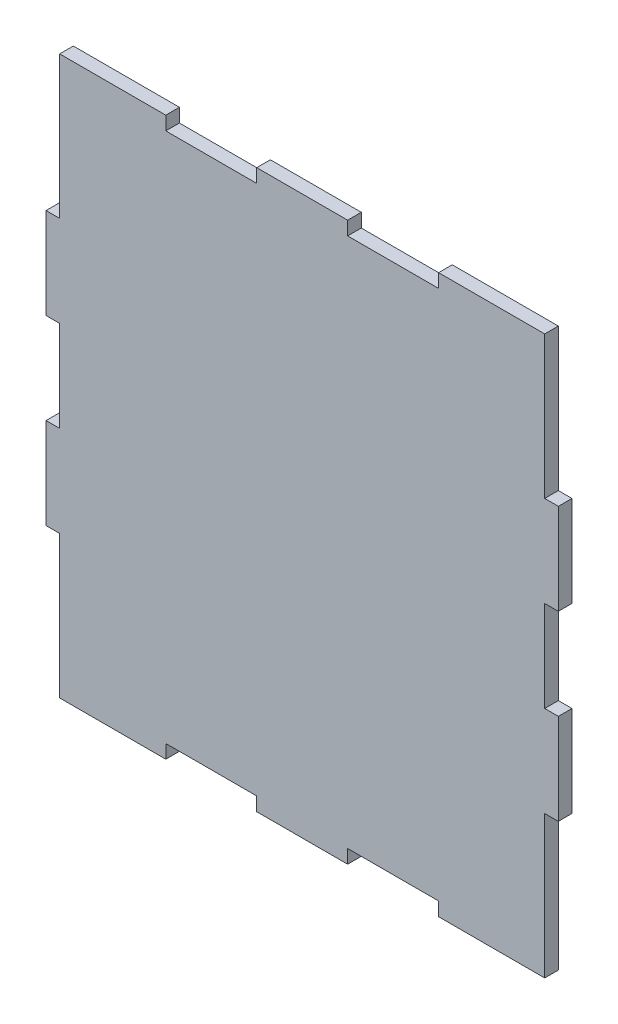
ISO-10303-21;
HEADER;
FILE_DESCRIPTION(('STEP AP214'),'2;1');
FILE_NAME('part.step','',(''),(''),'','','');
FILE_SCHEMA(('AUTOMOTIVE_DESIGN { 1 0 10303 214 1 1 1 1 }'));
ENDSEC;
DATA;
#1=APPLICATION_CONTEXT('core data for automotive mechanical design processes');
#2=APPLICATION_PROTOCOL_DEFINITION('international standard','automotive_design',2000,#1);
#3=PRODUCT_CONTEXT('',#1,'mechanical');
#4=PRODUCT('Part','Part','',(#3));
#5=PRODUCT_RELATED_PRODUCT_CATEGORY('part','',(#4));
#6=PRODUCT_DEFINITION_FORMATION('','',#4);
#7=PRODUCT_DEFINITION_CONTEXT('part definition',#1,'design');
#8=PRODUCT_DEFINITION('design','',#6,#7);
#9=PRODUCT_DEFINITION_SHAPE('','',#8);
#10=(LENGTH_UNIT() NAMED_UNIT(*) SI_UNIT(.MILLI.,.METRE.));
#11=(NAMED_UNIT(*) PLANE_ANGLE_UNIT() SI_UNIT($,.RADIAN.));
#12=(NAMED_UNIT(*) SI_UNIT($,.STERADIAN.) SOLID_ANGLE_UNIT());
#13=UNCERTAINTY_MEASURE_WITH_UNIT(LENGTH_MEASURE(1.E-05),#10,'distance_accuracy_value','');
#14=(GEOMETRIC_REPRESENTATION_CONTEXT(3) GLOBAL_UNCERTAINTY_ASSIGNED_CONTEXT((#13)) GLOBAL_UNIT_ASSIGNED_CONTEXT((#10,
#11,#12)) REPRESENTATION_CONTEXT('',''));
#15=CARTESIAN_POINT('',(0.,0.,0.));
#16=DIRECTION('',(0.,0.,1.));
#17=DIRECTION('',(1.,0.,0.));
#18=AXIS2_PLACEMENT_3D('',#15,#16,#17);
#19=CARTESIAN_POINT('',(181.,5.50000000000001,9.));
#20=DIRECTION('',(0.,1.,0.));
#21=DIRECTION('',(-1.,0.,0.));
#22=AXIS2_PLACEMENT_3D('',#19,#20,#21);
#23=PLANE('',#22);
#24=DIRECTION('',(1.,0.,0.));
#25=VECTOR('',#24,1.);
#26=CARTESIAN_POINT('',(181.,5.50000000000001,0.));
#27=LINE('',#26,#25);
#28=CARTESIAN_POINT('',(181.,5.50000000000001,0.));
#29=VERTEX_POINT('',#28);
#30=CARTESIAN_POINT('',(241.,5.50000000000002,0.));
#31=VERTEX_POINT('',#30);
#32=EDGE_CURVE('E311',#29,#31,#27,.T.);
#33=ORIENTED_EDGE('',*,*,#32,.T.);
#34=DIRECTION('',(0.,0.,-1.));
#35=VECTOR('',#34,1.);
#36=CARTESIAN_POINT('',(241.,5.50000000000002,9.));
#37=LINE('',#36,#35);
#38=CARTESIAN_POINT('',(241.,5.50000000000002,9.));
#39=VERTEX_POINT('',#38);
#40=EDGE_CURVE('E11',#39,#31,#37,.T.);
#41=ORIENTED_EDGE('',*,*,#40,.F.);
#42=DIRECTION('',(1.,0.,0.));
#43=VECTOR('',#42,1.);
#44=CARTESIAN_POINT('',(181.,5.50000000000001,9.));
#45=LINE('',#44,#43);
#46=CARTESIAN_POINT('',(181.,5.50000000000001,9.));
#47=VERTEX_POINT('',#46);
#48=EDGE_CURVE('E408',#47,#39,#45,.T.);
#49=ORIENTED_EDGE('',*,*,#48,.F.);
#50=DIRECTION('',(0.,0.,-1.));
#51=VECTOR('',#50,1.);
#52=CARTESIAN_POINT('',(181.,5.50000000000001,9.));
#53=LINE('',#52,#51);
#54=EDGE_CURVE('E61',#47,#29,#53,.T.);
#55=ORIENTED_EDGE('',*,*,#54,.T.);
#56=EDGE_LOOP('',(#33,#41,#49,#55));
#57=FACE_BOUND('',#56,.T.);
#58=ADVANCED_FACE('F45',(#57),#23,.F.);
#59=CARTESIAN_POINT('',(241.,5.50000000000002,9.));
#60=DIRECTION('',(1.,0.,0.));
#61=DIRECTION('',(0.,0.,-1.));
#62=AXIS2_PLACEMENT_3D('',#59,#60,#61);
#63=PLANE('',#62);
#64=DIRECTION('',(0.,-1.,0.));
#65=VECTOR('',#64,1.);
#66=CARTESIAN_POINT('',(241.,5.50000000000002,0.));
#67=LINE('',#66,#65);
#68=CARTESIAN_POINT('',(241.,-3.49999999999987,0.));
#69=VERTEX_POINT('',#68);
#70=EDGE_CURVE('E313',#31,#69,#67,.T.);
#71=ORIENTED_EDGE('',*,*,#70,.T.);
#72=DIRECTION('',(0.,0.,-1.));
#73=VECTOR('',#72,1.);
#74=CARTESIAN_POINT('',(241.,-3.49999999999987,9.));
#75=LINE('',#74,#73);
#76=CARTESIAN_POINT('',(241.,-3.49999999999987,9.));
#77=VERTEX_POINT('',#76);
#78=EDGE_CURVE('E53',#77,#69,#75,.T.);
#79=ORIENTED_EDGE('',*,*,#78,.F.);
#80=DIRECTION('',(0.,-1.,0.));
#81=VECTOR('',#80,1.);
#82=CARTESIAN_POINT('',(241.,5.50000000000002,9.));
#83=LINE('',#82,#81);
#84=EDGE_CURVE('E184',#39,#77,#83,.T.);
#85=ORIENTED_EDGE('',*,*,#84,.F.);
#86=ORIENTED_EDGE('',*,*,#40,.T.);
#87=EDGE_LOOP('',(#71,#79,#85,#86));
#88=FACE_BOUND('',#87,.T.);
#89=ADVANCED_FACE('F591',(#88),#63,.F.);
#90=CARTESIAN_POINT('',(241.,-3.49999999999987,9.));
#91=DIRECTION('',(0.,1.,0.));
#92=DIRECTION('',(-1.,0.,0.));
#93=AXIS2_PLACEMENT_3D('',#90,#91,#92);
#94=PLANE('',#93);
#95=DIRECTION('',(1.,0.,0.));
#96=VECTOR('',#95,1.);
#97=CARTESIAN_POINT('',(241.,-3.49999999999987,0.));
#98=LINE('',#97,#96);
#99=CARTESIAN_POINT('',(311.,-3.49999999999989,0.));
#100=VERTEX_POINT('',#99);
#101=EDGE_CURVE('E315',#69,#100,#98,.T.);
#102=ORIENTED_EDGE('',*,*,#101,.T.);
#103=DIRECTION('',(0.,0.,-1.));
#104=VECTOR('',#103,1.);
#105=CARTESIAN_POINT('',(311.,-3.49999999999989,9.));
#106=LINE('',#105,#104);
#107=CARTESIAN_POINT('',(311.,-3.49999999999989,9.));
#108=VERTEX_POINT('',#107);
#109=EDGE_CURVE('E475',#108,#100,#106,.T.);
#110=ORIENTED_EDGE('',*,*,#109,.F.);
#111=DIRECTION('',(1.,0.,0.));
#112=VECTOR('',#111,1.);
#113=CARTESIAN_POINT('',(241.,-3.49999999999987,9.));
#114=LINE('',#113,#112);
#115=EDGE_CURVE('E483',#77,#108,#114,.T.);
#116=ORIENTED_EDGE('',*,*,#115,.F.);
#117=ORIENTED_EDGE('',*,*,#78,.T.);
#118=EDGE_LOOP('',(#102,#110,#116,#117));
#119=FACE_BOUND('',#118,.T.);
#120=ADVANCED_FACE('F481',(#119),#94,.F.);
#121=CARTESIAN_POINT('',(311.,90.5,9.));
#122=DIRECTION('',(1.,0.,0.));
#123=DIRECTION('',(0.,1.,0.));
#124=AXIS2_PLACEMENT_3D('',#121,#122,#123);
#125=PLANE('',#124);
#126=DIRECTION('',(0.,-1.,0.));
#127=VECTOR('',#126,1.);
#128=CARTESIAN_POINT('',(311.,90.5,0.));
#129=LINE('',#128,#127);
#130=CARTESIAN_POINT('',(311.,90.5,0.));
#131=VERTEX_POINT('',#130);
#132=EDGE_CURVE('E318',#131,#100,#129,.T.);
#133=ORIENTED_EDGE('',*,*,#132,.F.);
#134=DIRECTION('',(0.,0.,-1.));
#135=VECTOR('',#134,1.);
#136=CARTESIAN_POINT('',(311.,90.5,9.));
#137=LINE('',#136,#135);
#138=CARTESIAN_POINT('',(311.,90.5,9.));
#139=VERTEX_POINT('',#138);
#140=EDGE_CURVE('E473',#139,#131,#137,.T.);
#141=ORIENTED_EDGE('',*,*,#140,.F.);
#142=DIRECTION('',(0.,-1.,0.));
#143=VECTOR('',#142,1.);
#144=CARTESIAN_POINT('',(311.,9.67,9.));
#145=LINE('',#144,#143);
#146=EDGE_CURVE('E492',#139,#108,#145,.T.);
#147=ORIENTED_EDGE('',*,*,#146,.T.);
#148=ORIENTED_EDGE('',*,*,#109,.T.);
#149=EDGE_LOOP('',(#133,#141,#147,#148));
#150=FACE_BOUND('',#149,.T.);
#151=ADVANCED_FACE('F491',(#150),#125,.T.);
#152=CARTESIAN_POINT('',(320.,90.5,9.));
#153=DIRECTION('',(0.,-1.,0.));
#154=DIRECTION('',(0.,0.,-1.));
#155=AXIS2_PLACEMENT_3D('',#152,#153,#154);
#156=PLANE('',#155);
#157=DIRECTION('',(-1.,0.,0.));
#158=VECTOR('',#157,1.);
#159=CARTESIAN_POINT('',(320.,90.5,0.));
#160=LINE('',#159,#158);
#161=CARTESIAN_POINT('',(320.,90.5,0.));
#162=VERTEX_POINT('',#161);
#163=EDGE_CURVE('E320',#162,#131,#160,.T.);
#164=ORIENTED_EDGE('',*,*,#163,.F.);
#165=DIRECTION('',(0.,0.,-1.));
#166=VECTOR('',#165,1.);
#167=CARTESIAN_POINT('',(320.,90.5,9.));
#168=LINE('',#167,#166);
#169=CARTESIAN_POINT('',(320.,90.5,9.));
#170=VERTEX_POINT('',#169);
#171=EDGE_CURVE('E471',#170,#162,#168,.T.);
#172=ORIENTED_EDGE('',*,*,#171,.F.);
#173=DIRECTION('',(-1.,0.,0.));
#174=VECTOR('',#173,1.);
#175=CARTESIAN_POINT('',(320.,90.5,9.));
#176=LINE('',#175,#174);
#177=EDGE_CURVE('E495',#170,#139,#176,.T.);
#178=ORIENTED_EDGE('',*,*,#177,.T.);
#179=ORIENTED_EDGE('',*,*,#140,.T.);
#180=EDGE_LOOP('',(#164,#172,#178,#179));
#181=FACE_BOUND('',#180,.T.);
#182=ADVANCED_FACE('F906',(#181),#156,.T.);
#183=CARTESIAN_POINT('',(320.,150.5,9.));
#184=DIRECTION('',(1.,0.,0.));
#185=DIRECTION('',(0.,1.,0.));
#186=AXIS2_PLACEMENT_3D('',#183,#184,#185);
#187=PLANE('',#186);
#188=DIRECTION('',(0.,-1.,0.));
#189=VECTOR('',#188,1.);
#190=CARTESIAN_POINT('',(320.,150.5,0.));
#191=LINE('',#190,#189);
#192=CARTESIAN_POINT('',(320.,150.5,0.));
#193=VERTEX_POINT('',#192);
#194=EDGE_CURVE('E323',#193,#162,#191,.T.);
#195=ORIENTED_EDGE('',*,*,#194,.F.);
#196=DIRECTION('',(0.,0.,-1.));
#197=VECTOR('',#196,1.);
#198=CARTESIAN_POINT('',(320.,150.5,9.));
#199=LINE('',#198,#197);
#200=CARTESIAN_POINT('',(320.,150.5,9.));
#201=VERTEX_POINT('',#200);
#202=EDGE_CURVE('E469',#201,#193,#199,.T.);
#203=ORIENTED_EDGE('',*,*,#202,.F.);
#204=DIRECTION('',(0.,-1.,0.));
#205=VECTOR('',#204,1.);
#206=CARTESIAN_POINT('',(320.,150.5,9.));
#207=LINE('',#206,#205);
#208=EDGE_CURVE('E497',#201,#170,#207,.T.);
#209=ORIENTED_EDGE('',*,*,#208,.T.);
#210=ORIENTED_EDGE('',*,*,#171,.T.);
#211=EDGE_LOOP('',(#195,#203,#209,#210));
#212=FACE_BOUND('',#211,.T.);
#213=ADVANCED_FACE('F896',(#212),#187,.T.);
#214=CARTESIAN_POINT('',(311.,150.5,9.));
#215=DIRECTION('',(0.,1.,0.));
#216=DIRECTION('',(0.,0.,1.));
#217=AXIS2_PLACEMENT_3D('',#214,#215,#216);
#218=PLANE('',#217);
#219=DIRECTION('',(1.,0.,0.));
#220=VECTOR('',#219,1.);
#221=CARTESIAN_POINT('',(311.,150.5,0.));
#222=LINE('',#221,#220);
#223=CARTESIAN_POINT('',(311.,150.5,0.));
#224=VERTEX_POINT('',#223);
#225=EDGE_CURVE('E326',#224,#193,#222,.T.);
#226=ORIENTED_EDGE('',*,*,#225,.F.);
#227=DIRECTION('',(0.,0.,-1.));
#228=VECTOR('',#227,1.);
#229=CARTESIAN_POINT('',(311.,150.5,9.));
#230=LINE('',#229,#228);
#231=CARTESIAN_POINT('',(311.,150.5,9.));
#232=VERTEX_POINT('',#231);
#233=EDGE_CURVE('E467',#232,#224,#230,.T.);
#234=ORIENTED_EDGE('',*,*,#233,.F.);
#235=DIRECTION('',(1.,0.,0.));
#236=VECTOR('',#235,1.);
#237=CARTESIAN_POINT('',(311.,150.5,9.));
#238=LINE('',#237,#236);
#239=EDGE_CURVE('E504',#232,#201,#238,.T.);
#240=ORIENTED_EDGE('',*,*,#239,.T.);
#241=ORIENTED_EDGE('',*,*,#202,.T.);
#242=EDGE_LOOP('',(#226,#234,#240,#241));
#243=FACE_BOUND('',#242,.T.);
#244=ADVANCED_FACE('F887',(#243),#218,.T.);
#245=CARTESIAN_POINT('',(311.,210.5,9.));
#246=DIRECTION('',(1.,0.,0.));
#247=DIRECTION('',(0.,0.,-1.));
#248=AXIS2_PLACEMENT_3D('',#245,#246,#247);
#249=PLANE('',#248);
#250=DIRECTION('',(0.,-1.,0.));
#251=VECTOR('',#250,1.);
#252=CARTESIAN_POINT('',(311.,210.5,0.));
#253=LINE('',#252,#251);
#254=CARTESIAN_POINT('',(311.,210.5,0.));
#255=VERTEX_POINT('',#254);
#256=EDGE_CURVE('E329',#255,#224,#253,.T.);
#257=ORIENTED_EDGE('',*,*,#256,.F.);
#258=DIRECTION('',(0.,0.,-1.));
#259=VECTOR('',#258,1.);
#260=CARTESIAN_POINT('',(311.,210.5,9.));
#261=LINE('',#260,#259);
#262=CARTESIAN_POINT('',(311.,210.5,9.));
#263=VERTEX_POINT('',#262);
#264=EDGE_CURVE('E465',#263,#255,#261,.T.);
#265=ORIENTED_EDGE('',*,*,#264,.F.);
#266=DIRECTION('',(0.,-1.,0.));
#267=VECTOR('',#266,1.);
#268=CARTESIAN_POINT('',(311.,210.5,9.));
#269=LINE('',#268,#267);
#270=EDGE_CURVE('E507',#263,#232,#269,.T.);
#271=ORIENTED_EDGE('',*,*,#270,.T.);
#272=ORIENTED_EDGE('',*,*,#233,.T.);
#273=EDGE_LOOP('',(#257,#265,#271,#272));
#274=FACE_BOUND('',#273,.T.);
#275=ADVANCED_FACE('F878',(#274),#249,.T.);
#276=CARTESIAN_POINT('',(311.,210.5,9.));
#277=DIRECTION('',(0.,1.,0.));
#278=DIRECTION('',(0.,0.,1.));
#279=AXIS2_PLACEMENT_3D('',#276,#277,#278);
#280=PLANE('',#279);
#281=DIRECTION('',(1.,0.,0.));
#282=VECTOR('',#281,1.);
#283=CARTESIAN_POINT('',(311.,210.5,0.));
#284=LINE('',#283,#282);
#285=CARTESIAN_POINT('',(320.,210.5,0.));
#286=VERTEX_POINT('',#285);
#287=EDGE_CURVE('E332',#255,#286,#284,.T.);
#288=ORIENTED_EDGE('',*,*,#287,.T.);
#289=DIRECTION('',(0.,0.,-1.));
#290=VECTOR('',#289,1.);
#291=CARTESIAN_POINT('',(320.,210.5,9.));
#292=LINE('',#291,#290);
#293=CARTESIAN_POINT('',(320.,210.5,9.));
#294=VERTEX_POINT('',#293);
#295=EDGE_CURVE('E463',#294,#286,#292,.T.);
#296=ORIENTED_EDGE('',*,*,#295,.F.);
#297=DIRECTION('',(1.,0.,0.));
#298=VECTOR('',#297,1.);
#299=CARTESIAN_POINT('',(311.,210.5,9.));
#300=LINE('',#299,#298);
#301=EDGE_CURVE('E510',#263,#294,#300,.T.);
#302=ORIENTED_EDGE('',*,*,#301,.F.);
#303=ORIENTED_EDGE('',*,*,#264,.T.);
#304=EDGE_LOOP('',(#288,#296,#302,#303));
#305=FACE_BOUND('',#304,.T.);
#306=ADVANCED_FACE('F866',(#305),#280,.F.);
#307=CARTESIAN_POINT('',(320.,270.5,9.));
#308=DIRECTION('',(1.,0.,0.));
#309=DIRECTION('',(0.,1.,0.));
#310=AXIS2_PLACEMENT_3D('',#307,#308,#309);
#311=PLANE('',#310);
#312=DIRECTION('',(0.,-1.,0.));
#313=VECTOR('',#312,1.);
#314=CARTESIAN_POINT('',(320.,270.5,0.));
#315=LINE('',#314,#313);
#316=CARTESIAN_POINT('',(320.,270.5,0.));
#317=VERTEX_POINT('',#316);
#318=EDGE_CURVE('E335',#317,#286,#315,.T.);
#319=ORIENTED_EDGE('',*,*,#318,.F.);
#320=DIRECTION('',(0.,0.,-1.));
#321=VECTOR('',#320,1.);
#322=CARTESIAN_POINT('',(320.,270.5,9.));
#323=LINE('',#322,#321);
#324=CARTESIAN_POINT('',(320.,270.5,9.));
#325=VERTEX_POINT('',#324);
#326=EDGE_CURVE('E461',#325,#317,#323,.T.);
#327=ORIENTED_EDGE('',*,*,#326,.F.);
#328=DIRECTION('',(0.,-1.,0.));
#329=VECTOR('',#328,1.);
#330=CARTESIAN_POINT('',(320.,270.5,9.));
#331=LINE('',#330,#329);
#332=EDGE_CURVE('E512',#325,#294,#331,.T.);
#333=ORIENTED_EDGE('',*,*,#332,.T.);
#334=ORIENTED_EDGE('',*,*,#295,.T.);
#335=EDGE_LOOP('',(#319,#327,#333,#334));
#336=FACE_BOUND('',#335,.T.);
#337=ADVANCED_FACE('F856',(#336),#311,.T.);
#338=CARTESIAN_POINT('',(320.,270.5,9.));
#339=DIRECTION('',(0.,-1.,0.));
#340=DIRECTION('',(0.,0.,-1.));
#341=AXIS2_PLACEMENT_3D('',#338,#339,#340);
#342=PLANE('',#341);
#343=DIRECTION('',(-1.,0.,0.));
#344=VECTOR('',#343,1.);
#345=CARTESIAN_POINT('',(320.,270.5,0.));
#346=LINE('',#345,#344);
#347=CARTESIAN_POINT('',(311.,270.5,0.));
#348=VERTEX_POINT('',#347);
#349=EDGE_CURVE('E338',#317,#348,#346,.T.);
#350=ORIENTED_EDGE('',*,*,#349,.T.);
#351=DIRECTION('',(0.,0.,-1.));
#352=VECTOR('',#351,1.);
#353=CARTESIAN_POINT('',(311.,270.5,9.));
#354=LINE('',#353,#352);
#355=CARTESIAN_POINT('',(311.,270.5,9.));
#356=VERTEX_POINT('',#355);
#357=EDGE_CURVE('E459',#356,#348,#354,.T.);
#358=ORIENTED_EDGE('',*,*,#357,.F.);
#359=DIRECTION('',(-1.,0.,0.));
#360=VECTOR('',#359,1.);
#361=CARTESIAN_POINT('',(320.,270.5,9.));
#362=LINE('',#361,#360);
#363=EDGE_CURVE('E515',#325,#356,#362,.T.);
#364=ORIENTED_EDGE('',*,*,#363,.F.);
#365=ORIENTED_EDGE('',*,*,#326,.T.);
#366=EDGE_LOOP('',(#350,#358,#364,#365));
#367=FACE_BOUND('',#366,.T.);
#368=ADVANCED_FACE('F847',(#367),#342,.F.);
#369=CARTESIAN_POINT('',(311.,364.5,9.));
#370=DIRECTION('',(1.,0.,0.));
#371=DIRECTION('',(0.,1.,0.));
#372=AXIS2_PLACEMENT_3D('',#369,#370,#371);
#373=PLANE('',#372);
#374=DIRECTION('',(0.,-1.,0.));
#375=VECTOR('',#374,1.);
#376=CARTESIAN_POINT('',(311.,364.5,0.));
#377=LINE('',#376,#375);
#378=CARTESIAN_POINT('',(311.,364.5,0.));
#379=VERTEX_POINT('',#378);
#380=EDGE_CURVE('E341',#379,#348,#377,.T.);
#381=ORIENTED_EDGE('',*,*,#380,.F.);
#382=DIRECTION('',(0.,0.,-1.));
#383=VECTOR('',#382,1.);
#384=CARTESIAN_POINT('',(311.,364.5,9.));
#385=LINE('',#384,#383);
#386=CARTESIAN_POINT('',(311.,364.5,9.));
#387=VERTEX_POINT('',#386);
#388=EDGE_CURVE('E457',#387,#379,#385,.T.);
#389=ORIENTED_EDGE('',*,*,#388,.F.);
#390=DIRECTION('',(0.,-1.,0.));
#391=VECTOR('',#390,1.);
#392=CARTESIAN_POINT('',(311.,364.5,9.));
#393=LINE('',#392,#391);
#394=EDGE_CURVE('E517',#387,#356,#393,.T.);
#395=ORIENTED_EDGE('',*,*,#394,.T.);
#396=ORIENTED_EDGE('',*,*,#357,.T.);
#397=EDGE_LOOP('',(#381,#389,#395,#396));
#398=FACE_BOUND('',#397,.T.);
#399=ADVANCED_FACE('F835',(#398),#373,.T.);
#400=CARTESIAN_POINT('',(241.,364.5,9.));
#401=DIRECTION('',(0.,1.,0.));
#402=DIRECTION('',(-1.,0.,0.));
#403=AXIS2_PLACEMENT_3D('',#400,#401,#402);
#404=PLANE('',#403);
#405=DIRECTION('',(1.,0.,0.));
#406=VECTOR('',#405,1.);
#407=CARTESIAN_POINT('',(241.,364.5,0.));
#408=LINE('',#407,#406);
#409=CARTESIAN_POINT('',(241.,364.5,0.));
#410=VERTEX_POINT('',#409);
#411=EDGE_CURVE('E344',#410,#379,#408,.T.);
#412=ORIENTED_EDGE('',*,*,#411,.F.);
#413=DIRECTION('',(0.,0.,-1.));
#414=VECTOR('',#413,1.);
#415=CARTESIAN_POINT('',(241.,364.5,9.));
#416=LINE('',#415,#414);
#417=CARTESIAN_POINT('',(241.,364.5,9.));
#418=VERTEX_POINT('',#417);
#419=EDGE_CURVE('E455',#418,#410,#416,.T.);
#420=ORIENTED_EDGE('',*,*,#419,.F.);
#421=DIRECTION('',(1.,0.,0.));
#422=VECTOR('',#421,1.);
#423=CARTESIAN_POINT('',(241.,364.5,9.));
#424=LINE('',#423,#422);
#425=EDGE_CURVE('E520',#418,#387,#424,.T.);
#426=ORIENTED_EDGE('',*,*,#425,.T.);
#427=ORIENTED_EDGE('',*,*,#388,.T.);
#428=EDGE_LOOP('',(#412,#420,#426,#427));
#429=FACE_BOUND('',#428,.T.);
#430=ADVANCED_FACE('F825',(#429),#404,.T.);
#431=CARTESIAN_POINT('',(241.,355.5,9.));
#432=DIRECTION('',(-1.,0.,0.));
#433=DIRECTION('',(0.,0.,1.));
#434=AXIS2_PLACEMENT_3D('',#431,#432,#433);
#435=PLANE('',#434);
#436=DIRECTION('',(0.,1.,0.));
#437=VECTOR('',#436,1.);
#438=CARTESIAN_POINT('',(241.,355.5,0.));
#439=LINE('',#438,#437);
#440=CARTESIAN_POINT('',(241.,355.5,0.));
#441=VERTEX_POINT('',#440);
#442=EDGE_CURVE('E347',#441,#410,#439,.T.);
#443=ORIENTED_EDGE('',*,*,#442,.F.);
#444=DIRECTION('',(0.,0.,-1.));
#445=VECTOR('',#444,1.);
#446=CARTESIAN_POINT('',(241.,355.5,9.));
#447=LINE('',#446,#445);
#448=CARTESIAN_POINT('',(241.,355.5,9.));
#449=VERTEX_POINT('',#448);
#450=EDGE_CURVE('E453',#449,#441,#447,.T.);
#451=ORIENTED_EDGE('',*,*,#450,.F.);
#452=DIRECTION('',(0.,1.,0.));
#453=VECTOR('',#452,1.);
#454=CARTESIAN_POINT('',(241.,355.5,9.));
#455=LINE('',#454,#453);
#456=EDGE_CURVE('E523',#449,#418,#455,.T.);
#457=ORIENTED_EDGE('',*,*,#456,.T.);
#458=ORIENTED_EDGE('',*,*,#419,.T.);
#459=EDGE_LOOP('',(#443,#451,#457,#458));
#460=FACE_BOUND('',#459,.T.);
#461=ADVANCED_FACE('F816',(#460),#435,.T.);
#462=CARTESIAN_POINT('',(181.,355.5,9.));
#463=DIRECTION('',(0.,1.,0.));
#464=DIRECTION('',(-1.,0.,0.));
#465=AXIS2_PLACEMENT_3D('',#462,#463,#464);
#466=PLANE('',#465);
#467=DIRECTION('',(1.,0.,0.));
#468=VECTOR('',#467,1.);
#469=CARTESIAN_POINT('',(181.,355.5,0.));
#470=LINE('',#469,#468);
#471=CARTESIAN_POINT('',(181.,355.5,0.));
#472=VERTEX_POINT('',#471);
#473=EDGE_CURVE('E350',#472,#441,#470,.T.);
#474=ORIENTED_EDGE('',*,*,#473,.F.);
#475=DIRECTION('',(0.,0.,-1.));
#476=VECTOR('',#475,1.);
#477=CARTESIAN_POINT('',(181.,355.5,9.));
#478=LINE('',#477,#476);
#479=CARTESIAN_POINT('',(181.,355.5,9.));
#480=VERTEX_POINT('',#479);
#481=EDGE_CURVE('E451',#480,#472,#478,.T.);
#482=ORIENTED_EDGE('',*,*,#481,.F.);
#483=DIRECTION('',(1.,0.,0.));
#484=VECTOR('',#483,1.);
#485=CARTESIAN_POINT('',(181.,355.5,9.));
#486=LINE('',#485,#484);
#487=EDGE_CURVE('E526',#480,#449,#486,.T.);
#488=ORIENTED_EDGE('',*,*,#487,.T.);
#489=ORIENTED_EDGE('',*,*,#450,.T.);
#490=EDGE_LOOP('',(#474,#482,#488,#489));
#491=FACE_BOUND('',#490,.T.);
#492=ADVANCED_FACE('F807',(#491),#466,.T.);
#493=CARTESIAN_POINT('',(181.,355.5,9.));
#494=DIRECTION('',(-1.,0.,0.));
#495=DIRECTION('',(0.,-1.,0.));
#496=AXIS2_PLACEMENT_3D('',#493,#494,#495);
#497=PLANE('',#496);
#498=DIRECTION('',(0.,1.,0.));
#499=VECTOR('',#498,1.);
#500=CARTESIAN_POINT('',(181.,355.5,0.));
#501=LINE('',#500,#499);
#502=CARTESIAN_POINT('',(181.,364.5,0.));
#503=VERTEX_POINT('',#502);
#504=EDGE_CURVE('E353',#472,#503,#501,.T.);
#505=ORIENTED_EDGE('',*,*,#504,.T.);
#506=DIRECTION('',(0.,0.,-1.));
#507=VECTOR('',#506,1.);
#508=CARTESIAN_POINT('',(181.,364.5,9.));
#509=LINE('',#508,#507);
#510=CARTESIAN_POINT('',(181.,364.5,9.));
#511=VERTEX_POINT('',#510);
#512=EDGE_CURVE('E449',#511,#503,#509,.T.);
#513=ORIENTED_EDGE('',*,*,#512,.F.);
#514=DIRECTION('',(0.,1.,0.));
#515=VECTOR('',#514,1.);
#516=CARTESIAN_POINT('',(181.,355.5,9.));
#517=LINE('',#516,#515);
#518=EDGE_CURVE('E529',#480,#511,#517,.T.);
#519=ORIENTED_EDGE('',*,*,#518,.F.);
#520=ORIENTED_EDGE('',*,*,#481,.T.);
#521=EDGE_LOOP('',(#505,#513,#519,#520));
#522=FACE_BOUND('',#521,.T.);
#523=ADVANCED_FACE('F796',(#522),#497,.F.);
#524=CARTESIAN_POINT('',(121.,364.5,9.));
#525=DIRECTION('',(0.,1.,0.));
#526=DIRECTION('',(0.,0.,1.));
#527=AXIS2_PLACEMENT_3D('',#524,#525,#526);
#528=PLANE('',#527);
#529=DIRECTION('',(1.,0.,0.));
#530=VECTOR('',#529,1.);
#531=CARTESIAN_POINT('',(121.,364.5,0.));
#532=LINE('',#531,#530);
#533=CARTESIAN_POINT('',(121.,364.5,0.));
#534=VERTEX_POINT('',#533);
#535=EDGE_CURVE('E356',#534,#503,#532,.T.);
#536=ORIENTED_EDGE('',*,*,#535,.F.);
#537=DIRECTION('',(0.,0.,-1.));
#538=VECTOR('',#537,1.);
#539=CARTESIAN_POINT('',(121.,364.5,9.));
#540=LINE('',#539,#538);
#541=CARTESIAN_POINT('',(121.,364.5,9.));
#542=VERTEX_POINT('',#541);
#543=EDGE_CURVE('E447',#542,#534,#540,.T.);
#544=ORIENTED_EDGE('',*,*,#543,.F.);
#545=DIRECTION('',(1.,0.,0.));
#546=VECTOR('',#545,1.);
#547=CARTESIAN_POINT('',(121.,364.5,9.));
#548=LINE('',#547,#546);
#549=EDGE_CURVE('E531',#542,#511,#548,.T.);
#550=ORIENTED_EDGE('',*,*,#549,.T.);
#551=ORIENTED_EDGE('',*,*,#512,.T.);
#552=EDGE_LOOP('',(#536,#544,#550,#551));
#553=FACE_BOUND('',#552,.T.);
#554=ADVANCED_FACE('F786',(#553),#528,.T.);
#555=CARTESIAN_POINT('',(121.,355.5,9.));
#556=DIRECTION('',(-1.,0.,0.));
#557=DIRECTION('',(0.,-1.,0.));
#558=AXIS2_PLACEMENT_3D('',#555,#556,#557);
#559=PLANE('',#558);
#560=DIRECTION('',(0.,1.,0.));
#561=VECTOR('',#560,1.);
#562=CARTESIAN_POINT('',(121.,355.5,0.));
#563=LINE('',#562,#561);
#564=CARTESIAN_POINT('',(121.,355.5,0.));
#565=VERTEX_POINT('',#564);
#566=EDGE_CURVE('E359',#565,#534,#563,.T.);
#567=ORIENTED_EDGE('',*,*,#566,.F.);
#568=DIRECTION('',(0.,0.,-1.));
#569=VECTOR('',#568,1.);
#570=CARTESIAN_POINT('',(121.,355.5,9.));
#571=LINE('',#570,#569);
#572=CARTESIAN_POINT('',(121.,355.5,9.));
#573=VERTEX_POINT('',#572);
#574=EDGE_CURVE('E445',#573,#565,#571,.T.);
#575=ORIENTED_EDGE('',*,*,#574,.F.);
#576=DIRECTION('',(0.,1.,0.));
#577=VECTOR('',#576,1.);
#578=CARTESIAN_POINT('',(121.,355.5,9.));
#579=LINE('',#578,#577);
#580=EDGE_CURVE('E534',#573,#542,#579,.T.);
#581=ORIENTED_EDGE('',*,*,#580,.T.);
#582=ORIENTED_EDGE('',*,*,#543,.T.);
#583=EDGE_LOOP('',(#567,#575,#581,#582));
#584=FACE_BOUND('',#583,.T.);
#585=ADVANCED_FACE('F777',(#584),#559,.T.);
#586=CARTESIAN_POINT('',(60.9999999999999,355.5,9.));
#587=DIRECTION('',(0.,1.,0.));
#588=DIRECTION('',(-1.,0.,0.));
#589=AXIS2_PLACEMENT_3D('',#586,#587,#588);
#590=PLANE('',#589);
#591=DIRECTION('',(1.,0.,0.));
#592=VECTOR('',#591,1.);
#593=CARTESIAN_POINT('',(60.9999999999999,355.5,0.));
#594=LINE('',#593,#592);
#595=CARTESIAN_POINT('',(60.9999999999999,355.5,0.));
#596=VERTEX_POINT('',#595);
#597=EDGE_CURVE('E362',#596,#565,#594,.T.);
#598=ORIENTED_EDGE('',*,*,#597,.F.);
#599=DIRECTION('',(0.,0.,-1.));
#600=VECTOR('',#599,1.);
#601=CARTESIAN_POINT('',(60.9999999999999,355.5,9.));
#602=LINE('',#601,#600);
#603=CARTESIAN_POINT('',(60.9999999999999,355.5,9.));
#604=VERTEX_POINT('',#603);
#605=EDGE_CURVE('E443',#604,#596,#602,.T.);
#606=ORIENTED_EDGE('',*,*,#605,.F.);
#607=DIRECTION('',(1.,0.,0.));
#608=VECTOR('',#607,1.);
#609=CARTESIAN_POINT('',(60.9999999999999,355.5,9.));
#610=LINE('',#609,#608);
#611=EDGE_CURVE('E537',#604,#573,#610,.T.);
#612=ORIENTED_EDGE('',*,*,#611,.T.);
#613=ORIENTED_EDGE('',*,*,#574,.T.);
#614=EDGE_LOOP('',(#598,#606,#612,#613));
#615=FACE_BOUND('',#614,.T.);
#616=ADVANCED_FACE('F768',(#615),#590,.T.);
#617=CARTESIAN_POINT('',(60.9999999999999,355.5,9.));
#618=DIRECTION('',(-1.,0.,0.));
#619=DIRECTION('',(0.,0.,1.));
#620=AXIS2_PLACEMENT_3D('',#617,#618,#619);
#621=PLANE('',#620);
#622=DIRECTION('',(0.,1.,0.));
#623=VECTOR('',#622,1.);
#624=CARTESIAN_POINT('',(60.9999999999999,355.5,0.));
#625=LINE('',#624,#623);
#626=CARTESIAN_POINT('',(60.9999999999999,364.5,0.));
#627=VERTEX_POINT('',#626);
#628=EDGE_CURVE('E365',#596,#627,#625,.T.);
#629=ORIENTED_EDGE('',*,*,#628,.T.);
#630=DIRECTION('',(0.,0.,-1.));
#631=VECTOR('',#630,1.);
#632=CARTESIAN_POINT('',(60.9999999999999,364.5,9.));
#633=LINE('',#632,#631);
#634=CARTESIAN_POINT('',(60.9999999999999,364.5,9.));
#635=VERTEX_POINT('',#634);
#636=EDGE_CURVE('E441',#635,#627,#633,.T.);
#637=ORIENTED_EDGE('',*,*,#636,.F.);
#638=DIRECTION('',(0.,1.,0.));
#639=VECTOR('',#638,1.);
#640=CARTESIAN_POINT('',(60.9999999999999,355.5,9.));
#641=LINE('',#640,#639);
#642=EDGE_CURVE('E540',#604,#635,#641,.T.);
#643=ORIENTED_EDGE('',*,*,#642,.F.);
#644=ORIENTED_EDGE('',*,*,#605,.T.);
#645=EDGE_LOOP('',(#629,#637,#643,#644));
#646=FACE_BOUND('',#645,.T.);
#647=ADVANCED_FACE('F757',(#646),#621,.F.);
#648=CARTESIAN_POINT('',(-9.00000000000017,364.5,9.));
#649=DIRECTION('',(0.,1.,0.));
#650=DIRECTION('',(-1.,0.,0.));
#651=AXIS2_PLACEMENT_3D('',#648,#649,#650);
#652=PLANE('',#651);
#653=DIRECTION('',(1.,0.,0.));
#654=VECTOR('',#653,1.);
#655=CARTESIAN_POINT('',(-9.00000000000017,364.5,0.));
#656=LINE('',#655,#654);
#657=CARTESIAN_POINT('',(-9.00000000000017,364.5,0.));
#658=VERTEX_POINT('',#657);
#659=EDGE_CURVE('E368',#658,#627,#656,.T.);
#660=ORIENTED_EDGE('',*,*,#659,.F.);
#661=DIRECTION('',(0.,0.,-1.));
#662=VECTOR('',#661,1.);
#663=CARTESIAN_POINT('',(-9.00000000000017,364.5,9.));
#664=LINE('',#663,#662);
#665=CARTESIAN_POINT('',(-9.00000000000017,364.5,9.));
#666=VERTEX_POINT('',#665);
#667=EDGE_CURVE('E439',#666,#658,#664,.T.);
#668=ORIENTED_EDGE('',*,*,#667,.F.);
#669=DIRECTION('',(1.,0.,0.));
#670=VECTOR('',#669,1.);
#671=CARTESIAN_POINT('',(-9.00000000000017,364.5,9.));
#672=LINE('',#671,#670);
#673=EDGE_CURVE('E542',#666,#635,#672,.T.);
#674=ORIENTED_EDGE('',*,*,#673,.T.);
#675=ORIENTED_EDGE('',*,*,#636,.T.);
#676=EDGE_LOOP('',(#660,#668,#674,#675));
#677=FACE_BOUND('',#676,.T.);
#678=ADVANCED_FACE('F746',(#677),#652,.T.);
#679=CARTESIAN_POINT('',(-9.00000000000017,364.5,9.));
#680=DIRECTION('',(1.,0.,0.));
#681=DIRECTION('',(0.,1.,0.));
#682=AXIS2_PLACEMENT_3D('',#679,#680,#681);
#683=PLANE('',#682);
#684=DIRECTION('',(0.,-1.,0.));
#685=VECTOR('',#684,1.);
#686=CARTESIAN_POINT('',(-9.00000000000017,364.5,0.));
#687=LINE('',#686,#685);
#688=CARTESIAN_POINT('',(-9.00000000000005,270.5,0.));
#689=VERTEX_POINT('',#688);
#690=EDGE_CURVE('E371',#658,#689,#687,.T.);
#691=ORIENTED_EDGE('',*,*,#690,.T.);
#692=DIRECTION('',(0.,0.,-1.));
#693=VECTOR('',#692,1.);
#694=CARTESIAN_POINT('',(-9.00000000000005,270.5,9.));
#695=LINE('',#694,#693);
#696=CARTESIAN_POINT('',(-9.00000000000005,270.5,9.));
#697=VERTEX_POINT('',#696);
#698=EDGE_CURVE('E437',#697,#689,#695,.T.);
#699=ORIENTED_EDGE('',*,*,#698,.F.);
#700=DIRECTION('',(0.,-1.,0.));
#701=VECTOR('',#700,1.);
#702=CARTESIAN_POINT('',(-9.00000000000017,364.5,9.));
#703=LINE('',#702,#701);
#704=EDGE_CURVE('E545',#666,#697,#703,.T.);
#705=ORIENTED_EDGE('',*,*,#704,.F.);
#706=ORIENTED_EDGE('',*,*,#667,.T.);
#707=EDGE_LOOP('',(#691,#699,#705,#706));
#708=FACE_BOUND('',#707,.T.);
#709=ADVANCED_FACE('F737',(#708),#683,.F.);
#710=CARTESIAN_POINT('',(-18.0000000000001,270.5,9.));
#711=DIRECTION('',(0.,1.,0.));
#712=DIRECTION('',(0.,0.,1.));
#713=AXIS2_PLACEMENT_3D('',#710,#711,#712);
#714=PLANE('',#713);
#715=DIRECTION('',(1.,0.,0.));
#716=VECTOR('',#715,1.);
#717=CARTESIAN_POINT('',(-18.0000000000001,270.5,0.));
#718=LINE('',#717,#716);
#719=CARTESIAN_POINT('',(-18.0000000000001,270.5,0.));
#720=VERTEX_POINT('',#719);
#721=EDGE_CURVE('E374',#720,#689,#718,.T.);
#722=ORIENTED_EDGE('',*,*,#721,.F.);
#723=DIRECTION('',(0.,0.,-1.));
#724=VECTOR('',#723,1.);
#725=CARTESIAN_POINT('',(-18.0000000000001,270.5,9.));
#726=LINE('',#725,#724);
#727=CARTESIAN_POINT('',(-18.0000000000001,270.5,9.));
#728=VERTEX_POINT('',#727);
#729=EDGE_CURVE('E435',#728,#720,#726,.T.);
#730=ORIENTED_EDGE('',*,*,#729,.F.);
#731=DIRECTION('',(1.,0.,0.));
#732=VECTOR('',#731,1.);
#733=CARTESIAN_POINT('',(-18.0000000000001,270.5,9.));
#734=LINE('',#733,#732);
#735=EDGE_CURVE('E547',#728,#697,#734,.T.);
#736=ORIENTED_EDGE('',*,*,#735,.T.);
#737=ORIENTED_EDGE('',*,*,#698,.T.);
#738=EDGE_LOOP('',(#722,#730,#736,#737));
#739=FACE_BOUND('',#738,.T.);
#740=ADVANCED_FACE('F725',(#739),#714,.T.);
#741=CARTESIAN_POINT('',(-18.0000000000001,270.5,9.));
#742=DIRECTION('',(1.,0.,0.));
#743=DIRECTION('',(0.,1.,0.));
#744=AXIS2_PLACEMENT_3D('',#741,#742,#743);
#745=PLANE('',#744);
#746=DIRECTION('',(0.,-1.,0.));
#747=VECTOR('',#746,1.);
#748=CARTESIAN_POINT('',(-18.0000000000001,270.5,0.));
#749=LINE('',#748,#747);
#750=CARTESIAN_POINT('',(-18.0000000000001,210.5,0.));
#751=VERTEX_POINT('',#750);
#752=EDGE_CURVE('E377',#720,#751,#749,.T.);
#753=ORIENTED_EDGE('',*,*,#752,.T.);
#754=DIRECTION('',(0.,0.,-1.));
#755=VECTOR('',#754,1.);
#756=CARTESIAN_POINT('',(-18.0000000000001,210.5,9.));
#757=LINE('',#756,#755);
#758=CARTESIAN_POINT('',(-18.0000000000001,210.5,9.));
#759=VERTEX_POINT('',#758);
#760=EDGE_CURVE('E433',#759,#751,#757,.T.);
#761=ORIENTED_EDGE('',*,*,#760,.F.);
#762=DIRECTION('',(0.,-1.,0.));
#763=VECTOR('',#762,1.);
#764=CARTESIAN_POINT('',(-18.0000000000001,270.5,9.));
#765=LINE('',#764,#763);
#766=EDGE_CURVE('E550',#728,#759,#765,.T.);
#767=ORIENTED_EDGE('',*,*,#766,.F.);
#768=ORIENTED_EDGE('',*,*,#729,.T.);
#769=EDGE_LOOP('',(#753,#761,#767,#768));
#770=FACE_BOUND('',#769,.T.);
#771=ADVANCED_FACE('F715',(#770),#745,.F.);
#772=CARTESIAN_POINT('',(-9.00000000000005,210.5,9.));
#773=DIRECTION('',(0.,-1.,0.));
#774=DIRECTION('',(0.,0.,-1.));
#775=AXIS2_PLACEMENT_3D('',#772,#773,#774);
#776=PLANE('',#775);
#777=DIRECTION('',(-1.,0.,0.));
#778=VECTOR('',#777,1.);
#779=CARTESIAN_POINT('',(-9.00000000000005,210.5,0.));
#780=LINE('',#779,#778);
#781=CARTESIAN_POINT('',(-9.00000000000005,210.5,0.));
#782=VERTEX_POINT('',#781);
#783=EDGE_CURVE('E380',#782,#751,#780,.T.);
#784=ORIENTED_EDGE('',*,*,#783,.F.);
#785=DIRECTION('',(0.,0.,-1.));
#786=VECTOR('',#785,1.);
#787=CARTESIAN_POINT('',(-9.00000000000005,210.5,9.));
#788=LINE('',#787,#786);
#789=CARTESIAN_POINT('',(-9.00000000000005,210.5,9.));
#790=VERTEX_POINT('',#789);
#791=EDGE_CURVE('E431',#790,#782,#788,.T.);
#792=ORIENTED_EDGE('',*,*,#791,.F.);
#793=DIRECTION('',(-1.,0.,0.));
#794=VECTOR('',#793,1.);
#795=CARTESIAN_POINT('',(-9.00000000000005,210.5,9.));
#796=LINE('',#795,#794);
#797=EDGE_CURVE('E552',#790,#759,#796,.T.);
#798=ORIENTED_EDGE('',*,*,#797,.T.);
#799=ORIENTED_EDGE('',*,*,#760,.T.);
#800=EDGE_LOOP('',(#784,#792,#798,#799));
#801=FACE_BOUND('',#800,.T.);
#802=ADVANCED_FACE('F706',(#801),#776,.T.);
#803=CARTESIAN_POINT('',(-9.00000000000005,210.5,9.));
#804=DIRECTION('',(1.,0.,0.));
#805=DIRECTION('',(0.,0.,-1.));
#806=AXIS2_PLACEMENT_3D('',#803,#804,#805);
#807=PLANE('',#806);
#808=DIRECTION('',(0.,-1.,0.));
#809=VECTOR('',#808,1.);
#810=CARTESIAN_POINT('',(-9.00000000000005,210.5,0.));
#811=LINE('',#810,#809);
#812=CARTESIAN_POINT('',(-9.00000000000005,150.5,0.));
#813=VERTEX_POINT('',#812);
#814=EDGE_CURVE('E383',#782,#813,#811,.T.);
#815=ORIENTED_EDGE('',*,*,#814,.T.);
#816=DIRECTION('',(0.,0.,-1.));
#817=VECTOR('',#816,1.);
#818=CARTESIAN_POINT('',(-9.00000000000005,150.5,9.));
#819=LINE('',#818,#817);
#820=CARTESIAN_POINT('',(-9.00000000000005,150.5,9.));
#821=VERTEX_POINT('',#820);
#822=EDGE_CURVE('E428',#821,#813,#819,.T.);
#823=ORIENTED_EDGE('',*,*,#822,.F.);
#824=DIRECTION('',(0.,-1.,0.));
#825=VECTOR('',#824,1.);
#826=CARTESIAN_POINT('',(-9.00000000000005,210.5,9.));
#827=LINE('',#826,#825);
#828=EDGE_CURVE('E555',#790,#821,#827,.T.);
#829=ORIENTED_EDGE('',*,*,#828,.F.);
#830=ORIENTED_EDGE('',*,*,#791,.T.);
#831=EDGE_LOOP('',(#815,#823,#829,#830));
#832=FACE_BOUND('',#831,.T.);
#833=ADVANCED_FACE('F697',(#832),#807,.F.);
#834=CARTESIAN_POINT('',(-9.00000000000005,150.5,9.));
#835=DIRECTION('',(0.,-1.,0.));
#836=DIRECTION('',(0.,0.,-1.));
#837=AXIS2_PLACEMENT_3D('',#834,#835,#836);
#838=PLANE('',#837);
#839=DIRECTION('',(-1.,0.,0.));
#840=VECTOR('',#839,1.);
#841=CARTESIAN_POINT('',(-9.00000000000005,150.5,0.));
#842=LINE('',#841,#840);
#843=CARTESIAN_POINT('',(-18.0000000000001,150.5,0.));
#844=VERTEX_POINT('',#843);
#845=EDGE_CURVE('E385',#813,#844,#842,.T.);
#846=ORIENTED_EDGE('',*,*,#845,.T.);
#847=DIRECTION('',(0.,0.,-1.));
#848=VECTOR('',#847,1.);
#849=CARTESIAN_POINT('',(-18.0000000000001,150.5,9.));
#850=LINE('',#849,#848);
#851=CARTESIAN_POINT('',(-18.0000000000001,150.5,9.));
#852=VERTEX_POINT('',#851);
#853=EDGE_CURVE('E425',#852,#844,#850,.T.);
#854=ORIENTED_EDGE('',*,*,#853,.F.);
#855=DIRECTION('',(-1.,0.,0.));
#856=VECTOR('',#855,1.);
#857=CARTESIAN_POINT('',(-9.00000000000005,150.5,9.));
#858=LINE('',#857,#856);
#859=EDGE_CURVE('E557',#821,#852,#858,.T.);
#860=ORIENTED_EDGE('',*,*,#859,.F.);
#861=ORIENTED_EDGE('',*,*,#822,.T.);
#862=EDGE_LOOP('',(#846,#854,#860,#861));
#863=FACE_BOUND('',#862,.T.);
#864=ADVANCED_FACE('F684',(#863),#838,.F.);
#865=CARTESIAN_POINT('',(-18.0000000000001,150.5,9.));
#866=DIRECTION('',(1.,0.,0.));
#867=DIRECTION('',(0.,1.,0.));
#868=AXIS2_PLACEMENT_3D('',#865,#866,#867);
#869=PLANE('',#868);
#870=DIRECTION('',(0.,-1.,0.));
#871=VECTOR('',#870,1.);
#872=CARTESIAN_POINT('',(-18.0000000000001,150.5,0.));
#873=LINE('',#872,#871);
#874=CARTESIAN_POINT('',(-18.0000000000001,90.5,0.));
#875=VERTEX_POINT('',#874);
#876=EDGE_CURVE('E387',#844,#875,#873,.T.);
#877=ORIENTED_EDGE('',*,*,#876,.T.);
#878=DIRECTION('',(0.,0.,-1.));
#879=VECTOR('',#878,1.);
#880=CARTESIAN_POINT('',(-18.0000000000001,90.5,9.));
#881=LINE('',#880,#879);
#882=CARTESIAN_POINT('',(-18.0000000000001,90.5,9.));
#883=VERTEX_POINT('',#882);
#884=EDGE_CURVE('E422',#883,#875,#881,.T.);
#885=ORIENTED_EDGE('',*,*,#884,.F.);
#886=DIRECTION('',(0.,-1.,0.));
#887=VECTOR('',#886,1.);
#888=CARTESIAN_POINT('',(-18.0000000000001,150.5,9.));
#889=LINE('',#888,#887);
#890=EDGE_CURVE('E559',#852,#883,#889,.T.);
#891=ORIENTED_EDGE('',*,*,#890,.F.);
#892=ORIENTED_EDGE('',*,*,#853,.T.);
#893=EDGE_LOOP('',(#877,#885,#891,#892));
#894=FACE_BOUND('',#893,.T.);
#895=ADVANCED_FACE('F673',(#894),#869,.F.);
#896=CARTESIAN_POINT('',(-18.0000000000001,90.5,9.));
#897=DIRECTION('',(0.,1.,0.));
#898=DIRECTION('',(0.,0.,1.));
#899=AXIS2_PLACEMENT_3D('',#896,#897,#898);
#900=PLANE('',#899);
#901=DIRECTION('',(1.,0.,0.));
#902=VECTOR('',#901,1.);
#903=CARTESIAN_POINT('',(-18.0000000000001,90.5,0.));
#904=LINE('',#903,#902);
#905=CARTESIAN_POINT('',(-9.00000000000005,90.5,0.));
#906=VERTEX_POINT('',#905);
#907=EDGE_CURVE('E389',#875,#906,#904,.T.);
#908=ORIENTED_EDGE('',*,*,#907,.T.);
#909=DIRECTION('',(0.,0.,-1.));
#910=VECTOR('',#909,1.);
#911=CARTESIAN_POINT('',(-9.00000000000005,90.5,9.));
#912=LINE('',#911,#910);
#913=CARTESIAN_POINT('',(-9.00000000000005,90.5,9.));
#914=VERTEX_POINT('',#913);
#915=EDGE_CURVE('E419',#914,#906,#912,.T.);
#916=ORIENTED_EDGE('',*,*,#915,.F.);
#917=DIRECTION('',(1.,0.,0.));
#918=VECTOR('',#917,1.);
#919=CARTESIAN_POINT('',(-18.0000000000001,90.5,9.));
#920=LINE('',#919,#918);
#921=EDGE_CURVE('E561',#883,#914,#920,.T.);
#922=ORIENTED_EDGE('',*,*,#921,.F.);
#923=ORIENTED_EDGE('',*,*,#884,.T.);
#924=EDGE_LOOP('',(#908,#916,#922,#923));
#925=FACE_BOUND('',#924,.T.);
#926=ADVANCED_FACE('F663',(#925),#900,.F.);
#927=CARTESIAN_POINT('',(-9.00000000000004,5.5,9.));
#928=DIRECTION('',(1.,0.,0.));
#929=DIRECTION('',(0.,1.,0.));
#930=AXIS2_PLACEMENT_3D('',#927,#928,#929);
#931=PLANE('',#930);
#932=DIRECTION('',(0.,-1.,0.));
#933=VECTOR('',#932,1.);
#934=CARTESIAN_POINT('',(-9.00000000000004,5.5,0.));
#935=LINE('',#934,#933);
#936=CARTESIAN_POINT('',(-9.00000000000003,-3.49999999999988,0.));
#937=VERTEX_POINT('',#936);
#938=EDGE_CURVE('E392',#906,#937,#935,.T.);
#939=ORIENTED_EDGE('',*,*,#938,.T.);
#940=DIRECTION('',(0.,0.,-1.));
#941=VECTOR('',#940,1.);
#942=CARTESIAN_POINT('',(-9.00000000000003,-3.49999999999988,9.));
#943=LINE('',#942,#941);
#944=CARTESIAN_POINT('',(-9.00000000000003,-3.49999999999988,9.));
#945=VERTEX_POINT('',#944);
#946=EDGE_CURVE('E416',#945,#937,#943,.T.);
#947=ORIENTED_EDGE('',*,*,#946,.F.);
#948=DIRECTION('',(0.,-1.,0.));
#949=VECTOR('',#948,1.);
#950=CARTESIAN_POINT('',(-9.00000000000005,90.5,9.));
#951=LINE('',#950,#949);
#952=EDGE_CURVE('E563',#914,#945,#951,.T.);
#953=ORIENTED_EDGE('',*,*,#952,.F.);
#954=ORIENTED_EDGE('',*,*,#915,.T.);
#955=EDGE_LOOP('',(#939,#947,#953,#954));
#956=FACE_BOUND('',#955,.T.);
#957=ADVANCED_FACE('F653',(#956),#931,.F.);
#958=CARTESIAN_POINT('',(-9.00000000000003,-3.49999999999988,9.));
#959=DIRECTION('',(0.,1.,0.));
#960=DIRECTION('',(-1.,0.,0.));
#961=AXIS2_PLACEMENT_3D('',#958,#959,#960);
#962=PLANE('',#961);
#963=DIRECTION('',(1.,0.,0.));
#964=VECTOR('',#963,1.);
#965=CARTESIAN_POINT('',(-9.00000000000003,-3.49999999999988,0.));
#966=LINE('',#965,#964);
#967=CARTESIAN_POINT('',(61.,-3.4999999999999,0.));
#968=VERTEX_POINT('',#967);
#969=EDGE_CURVE('E394',#937,#968,#966,.T.);
#970=ORIENTED_EDGE('',*,*,#969,.T.);
#971=DIRECTION('',(0.,0.,-1.));
#972=VECTOR('',#971,1.);
#973=CARTESIAN_POINT('',(61.,-3.4999999999999,9.));
#974=LINE('',#973,#972);
#975=CARTESIAN_POINT('',(61.,-3.4999999999999,9.));
#976=VERTEX_POINT('',#975);
#977=EDGE_CURVE('E414',#976,#968,#974,.T.);
#978=ORIENTED_EDGE('',*,*,#977,.F.);
#979=DIRECTION('',(1.,0.,0.));
#980=VECTOR('',#979,1.);
#981=CARTESIAN_POINT('',(-9.00000000000003,-3.49999999999988,9.));
#982=LINE('',#981,#980);
#983=EDGE_CURVE('E565',#945,#976,#982,.T.);
#984=ORIENTED_EDGE('',*,*,#983,.F.);
#985=ORIENTED_EDGE('',*,*,#946,.T.);
#986=EDGE_LOOP('',(#970,#978,#984,#985));
#987=FACE_BOUND('',#986,.T.);
#988=ADVANCED_FACE('F577',(#987),#962,.F.);
#989=CARTESIAN_POINT('',(61.,5.5,9.));
#990=DIRECTION('',(1.,0.,0.));
#991=DIRECTION('',(0.,0.,-1.));
#992=AXIS2_PLACEMENT_3D('',#989,#990,#991);
#993=PLANE('',#992);
#994=DIRECTION('',(0.,-1.,0.));
#995=VECTOR('',#994,1.);
#996=CARTESIAN_POINT('',(61.,5.5,0.));
#997=LINE('',#996,#995);
#998=CARTESIAN_POINT('',(61.,5.5,0.));
#999=VERTEX_POINT('',#998);
#1000=EDGE_CURVE('E397',#999,#968,#997,.T.);
#1001=ORIENTED_EDGE('',*,*,#1000,.F.);
#1002=DIRECTION('',(0.,0.,-1.));
#1003=VECTOR('',#1002,1.);
#1004=CARTESIAN_POINT('',(61.,5.5,9.));
#1005=LINE('',#1004,#1003);
#1006=CARTESIAN_POINT('',(61.,5.5,9.));
#1007=VERTEX_POINT('',#1006);
#1008=EDGE_CURVE('E412',#1007,#999,#1005,.T.);
#1009=ORIENTED_EDGE('',*,*,#1008,.F.);
#1010=DIRECTION('',(0.,-1.,0.));
#1011=VECTOR('',#1010,1.);
#1012=CARTESIAN_POINT('',(61.,5.5,9.));
#1013=LINE('',#1012,#1011);
#1014=EDGE_CURVE('E567',#1007,#976,#1013,.T.);
#1015=ORIENTED_EDGE('',*,*,#1014,.T.);
#1016=ORIENTED_EDGE('',*,*,#977,.T.);
#1017=EDGE_LOOP('',(#1001,#1009,#1015,#1016));
#1018=FACE_BOUND('',#1017,.T.);
#1019=ADVANCED_FACE('F571',(#1018),#993,.T.);
#1020=CARTESIAN_POINT('',(61.,5.5,9.));
#1021=DIRECTION('',(0.,1.,0.));
#1022=DIRECTION('',(0.,0.,1.));
#1023=AXIS2_PLACEMENT_3D('',#1020,#1021,#1022);
#1024=PLANE('',#1023);
#1025=DIRECTION('',(1.,0.,0.));
#1026=VECTOR('',#1025,1.);
#1027=CARTESIAN_POINT('',(61.,5.5,0.));
#1028=LINE('',#1027,#1026);
#1029=CARTESIAN_POINT('',(121.,5.5,0.));
#1030=VERTEX_POINT('',#1029);
#1031=EDGE_CURVE('E400',#999,#1030,#1028,.T.);
#1032=ORIENTED_EDGE('',*,*,#1031,.T.);
#1033=DIRECTION('',(0.,0.,-1.));
#1034=VECTOR('',#1033,1.);
#1035=CARTESIAN_POINT('',(121.,5.5,9.));
#1036=LINE('',#1035,#1034);
#1037=CARTESIAN_POINT('',(121.,5.5,9.));
#1038=VERTEX_POINT('',#1037);
#1039=EDGE_CURVE('E303',#1038,#1030,#1036,.T.);
#1040=ORIENTED_EDGE('',*,*,#1039,.F.);
#1041=DIRECTION('',(1.,0.,0.));
#1042=VECTOR('',#1041,1.);
#1043=CARTESIAN_POINT('',(61.,5.5,9.));
#1044=LINE('',#1043,#1042);
#1045=EDGE_CURVE('E291',#1007,#1038,#1044,.T.);
#1046=ORIENTED_EDGE('',*,*,#1045,.F.);
#1047=ORIENTED_EDGE('',*,*,#1008,.T.);
#1048=EDGE_LOOP('',(#1032,#1040,#1046,#1047));
#1049=FACE_BOUND('',#1048,.T.);
#1050=ADVANCED_FACE('F581',(#1049),#1024,.F.);
#1051=CARTESIAN_POINT('',(121.,5.5,9.));
#1052=DIRECTION('',(1.,0.,0.));
#1053=DIRECTION('',(0.,1.,0.));
#1054=AXIS2_PLACEMENT_3D('',#1051,#1052,#1053);
#1055=PLANE('',#1054);
#1056=DIRECTION('',(0.,-1.,0.));
#1057=VECTOR('',#1056,1.);
#1058=CARTESIAN_POINT('',(121.,5.5,0.));
#1059=LINE('',#1058,#1057);
#1060=CARTESIAN_POINT('',(121.,-3.50000000000001,0.));
#1061=VERTEX_POINT('',#1060);
#1062=EDGE_CURVE('E300',#1030,#1061,#1059,.T.);
#1063=ORIENTED_EDGE('',*,*,#1062,.T.);
#1064=DIRECTION('',(0.,0.,-1.));
#1065=VECTOR('',#1064,1.);
#1066=CARTESIAN_POINT('',(121.,-3.50000000000001,9.));
#1067=LINE('',#1066,#1065);
#1068=CARTESIAN_POINT('',(121.,-3.50000000000001,9.));
#1069=VERTEX_POINT('',#1068);
#1070=EDGE_CURVE('E297',#1069,#1061,#1067,.T.);
#1071=ORIENTED_EDGE('',*,*,#1070,.F.);
#1072=DIRECTION('',(0.,-1.,0.));
#1073=VECTOR('',#1072,1.);
#1074=CARTESIAN_POINT('',(121.,5.5,9.));
#1075=LINE('',#1074,#1073);
#1076=EDGE_CURVE('E283',#1038,#1069,#1075,.T.);
#1077=ORIENTED_EDGE('',*,*,#1076,.F.);
#1078=ORIENTED_EDGE('',*,*,#1039,.T.);
#1079=EDGE_LOOP('',(#1063,#1071,#1077,#1078));
#1080=FACE_BOUND('',#1079,.T.);
#1081=ADVANCED_FACE('F298',(#1080),#1055,.F.);
#1082=CARTESIAN_POINT('',(121.,-3.50000000000001,9.));
#1083=DIRECTION('',(0.,1.,0.));
#1084=DIRECTION('',(-1.,0.,0.));
#1085=AXIS2_PLACEMENT_3D('',#1082,#1083,#1084);
#1086=PLANE('',#1085);
#1087=DIRECTION('',(1.,0.,0.));
#1088=VECTOR('',#1087,1.);
#1089=CARTESIAN_POINT('',(121.,-3.50000000000001,0.));
#1090=LINE('',#1089,#1088);
#1091=CARTESIAN_POINT('',(181.,-3.5,0.));
#1092=VERTEX_POINT('',#1091);
#1093=EDGE_CURVE('E403',#1061,#1092,#1090,.T.);
#1094=ORIENTED_EDGE('',*,*,#1093,.T.);
#1095=DIRECTION('',(0.,0.,-1.));
#1096=VECTOR('',#1095,1.);
#1097=CARTESIAN_POINT('',(181.,-3.5,9.));
#1098=LINE('',#1097,#1096);
#1099=CARTESIAN_POINT('',(181.,-3.5,9.));
#1100=VERTEX_POINT('',#1099);
#1101=EDGE_CURVE('E172',#1100,#1092,#1098,.T.);
#1102=ORIENTED_EDGE('',*,*,#1101,.F.);
#1103=DIRECTION('',(1.,0.,0.));
#1104=VECTOR('',#1103,1.);
#1105=CARTESIAN_POINT('',(121.,-3.50000000000001,9.));
#1106=LINE('',#1105,#1104);
#1107=EDGE_CURVE('E288',#1069,#1100,#1106,.T.);
#1108=ORIENTED_EDGE('',*,*,#1107,.F.);
#1109=ORIENTED_EDGE('',*,*,#1070,.T.);
#1110=EDGE_LOOP('',(#1094,#1102,#1108,#1109));
#1111=FACE_BOUND('',#1110,.T.);
#1112=ADVANCED_FACE('F305',(#1111),#1086,.F.);
#1113=CARTESIAN_POINT('',(181.,5.50000000000001,9.));
#1114=DIRECTION('',(1.,0.,0.));
#1115=DIRECTION('',(0.,1.,0.));
#1116=AXIS2_PLACEMENT_3D('',#1113,#1114,#1115);
#1117=PLANE('',#1116);
#1118=DIRECTION('',(0.,-1.,0.));
#1119=VECTOR('',#1118,1.);
#1120=CARTESIAN_POINT('',(181.,5.50000000000001,0.));
#1121=LINE('',#1120,#1119);
#1122=EDGE_CURVE('E405',#29,#1092,#1121,.T.);
#1123=ORIENTED_EDGE('',*,*,#1122,.F.);
#1124=ORIENTED_EDGE('',*,*,#54,.F.);
#1125=DIRECTION('',(0.,-1.,0.));
#1126=VECTOR('',#1125,1.);
#1127=CARTESIAN_POINT('',(181.,5.50000000000001,9.));
#1128=LINE('',#1127,#1126);
#1129=EDGE_CURVE('E306',#47,#1100,#1128,.T.);
#1130=ORIENTED_EDGE('',*,*,#1129,.T.);
#1131=ORIENTED_EDGE('',*,*,#1101,.T.);
#1132=EDGE_LOOP('',(#1123,#1124,#1130,#1131));
#1133=FACE_BOUND('',#1132,.T.);
#1134=ADVANCED_FACE('F596',(#1133),#1117,.T.);
#1135=CARTESIAN_POINT('',(0.,0.,9.));
#1136=DIRECTION('',(0.,0.,-1.));
#1137=DIRECTION('',(-1.,0.,0.));
#1138=AXIS2_PLACEMENT_3D('',#1135,#1136,#1137);
#1139=PLANE('',#1138);
#1140=ORIENTED_EDGE('',*,*,#48,.T.);
#1141=ORIENTED_EDGE('',*,*,#84,.T.);
#1142=ORIENTED_EDGE('',*,*,#115,.T.);
#1143=ORIENTED_EDGE('',*,*,#146,.F.);
#1144=ORIENTED_EDGE('',*,*,#177,.F.);
#1145=ORIENTED_EDGE('',*,*,#208,.F.);
#1146=ORIENTED_EDGE('',*,*,#239,.F.);
#1147=ORIENTED_EDGE('',*,*,#270,.F.);
#1148=ORIENTED_EDGE('',*,*,#301,.T.);
#1149=ORIENTED_EDGE('',*,*,#332,.F.);
#1150=ORIENTED_EDGE('',*,*,#363,.T.);
#1151=ORIENTED_EDGE('',*,*,#394,.F.);
#1152=ORIENTED_EDGE('',*,*,#425,.F.);
#1153=ORIENTED_EDGE('',*,*,#456,.F.);
#1154=ORIENTED_EDGE('',*,*,#487,.F.);
#1155=ORIENTED_EDGE('',*,*,#518,.T.);
#1156=ORIENTED_EDGE('',*,*,#549,.F.);
#1157=ORIENTED_EDGE('',*,*,#580,.F.);
#1158=ORIENTED_EDGE('',*,*,#611,.F.);
#1159=ORIENTED_EDGE('',*,*,#642,.T.);
#1160=ORIENTED_EDGE('',*,*,#673,.F.);
#1161=ORIENTED_EDGE('',*,*,#704,.T.);
#1162=ORIENTED_EDGE('',*,*,#735,.F.);
#1163=ORIENTED_EDGE('',*,*,#766,.T.);
#1164=ORIENTED_EDGE('',*,*,#797,.F.);
#1165=ORIENTED_EDGE('',*,*,#828,.T.);
#1166=ORIENTED_EDGE('',*,*,#859,.T.);
#1167=ORIENTED_EDGE('',*,*,#890,.T.);
#1168=ORIENTED_EDGE('',*,*,#921,.T.);
#1169=ORIENTED_EDGE('',*,*,#952,.T.);
#1170=ORIENTED_EDGE('',*,*,#983,.T.);
#1171=ORIENTED_EDGE('',*,*,#1014,.F.);
#1172=ORIENTED_EDGE('',*,*,#1045,.T.);
#1173=ORIENTED_EDGE('',*,*,#1076,.T.);
#1174=ORIENTED_EDGE('',*,*,#1107,.T.);
#1175=ORIENTED_EDGE('',*,*,#1129,.F.);
#1176=EDGE_LOOP('',(#1140,#1141,#1142,#1143,#1144,#1145,#1146,#1147,#1148,#1149,#1150,#1151,
#1152,#1153,#1154,#1155,#1156,#1157,#1158,#1159,#1160,#1161,#1162,#1163,#1164,#1165,#1166,#1167,
#1168,#1169,#1170,#1171,#1172,#1173,#1174,#1175));
#1177=FACE_BOUND('',#1176,.T.);
#1178=ADVANCED_FACE('F285',(#1177),#1139,.F.);
#1179=CARTESIAN_POINT('',(0.,0.,0.));
#1180=DIRECTION('',(0.,0.,-1.));
#1181=DIRECTION('',(-1.,0.,0.));
#1182=AXIS2_PLACEMENT_3D('',#1179,#1180,#1181);
#1183=PLANE('',#1182);
#1184=ORIENTED_EDGE('',*,*,#32,.F.);
#1185=ORIENTED_EDGE('',*,*,#1122,.T.);
#1186=ORIENTED_EDGE('',*,*,#1093,.F.);
#1187=ORIENTED_EDGE('',*,*,#1062,.F.);
#1188=ORIENTED_EDGE('',*,*,#1031,.F.);
#1189=ORIENTED_EDGE('',*,*,#1000,.T.);
#1190=ORIENTED_EDGE('',*,*,#969,.F.);
#1191=ORIENTED_EDGE('',*,*,#938,.F.);
#1192=ORIENTED_EDGE('',*,*,#907,.F.);
#1193=ORIENTED_EDGE('',*,*,#876,.F.);
#1194=ORIENTED_EDGE('',*,*,#845,.F.);
#1195=ORIENTED_EDGE('',*,*,#814,.F.);
#1196=ORIENTED_EDGE('',*,*,#783,.T.);
#1197=ORIENTED_EDGE('',*,*,#752,.F.);
#1198=ORIENTED_EDGE('',*,*,#721,.T.);
#1199=ORIENTED_EDGE('',*,*,#690,.F.);
#1200=ORIENTED_EDGE('',*,*,#659,.T.);
#1201=ORIENTED_EDGE('',*,*,#628,.F.);
#1202=ORIENTED_EDGE('',*,*,#597,.T.);
#1203=ORIENTED_EDGE('',*,*,#566,.T.);
#1204=ORIENTED_EDGE('',*,*,#535,.T.);
#1205=ORIENTED_EDGE('',*,*,#504,.F.);
#1206=ORIENTED_EDGE('',*,*,#473,.T.);
#1207=ORIENTED_EDGE('',*,*,#442,.T.);
#1208=ORIENTED_EDGE('',*,*,#411,.T.);
#1209=ORIENTED_EDGE('',*,*,#380,.T.);
#1210=ORIENTED_EDGE('',*,*,#349,.F.);
#1211=ORIENTED_EDGE('',*,*,#318,.T.);
#1212=ORIENTED_EDGE('',*,*,#287,.F.);
#1213=ORIENTED_EDGE('',*,*,#256,.T.);
#1214=ORIENTED_EDGE('',*,*,#225,.T.);
#1215=ORIENTED_EDGE('',*,*,#194,.T.);
#1216=ORIENTED_EDGE('',*,*,#163,.T.);
#1217=ORIENTED_EDGE('',*,*,#132,.T.);
#1218=ORIENTED_EDGE('',*,*,#101,.F.);
#1219=ORIENTED_EDGE('',*,*,#70,.F.);
#1220=EDGE_LOOP('',(#1184,#1185,#1186,#1187,#1188,#1189,#1190,#1191,#1192,#1193,#1194,#1195,
#1196,#1197,#1198,#1199,#1200,#1201,#1202,#1203,#1204,#1205,#1206,#1207,#1208,#1209,#1210,#1211,
#1212,#1213,#1214,#1215,#1216,#1217,#1218,#1219));
#1221=FACE_BOUND('',#1220,.T.);
#1222=ADVANCED_FACE('F485',(#1221),#1183,.T.);
#1223=CLOSED_SHELL('',(#58,#89,#120,#151,#182,#213,#244,#275,#306,#337,#368,#399,#430,#461,#492,
#523,#554,#585,#616,#647,#678,#709,#740,#771,#802,#833,#864,#895,#926,#957,#988,#1019,#1050,
#1081,#1112,#1134,#1178,#1222));
#1224=MANIFOLD_SOLID_BREP('B2',#1223);
#1225=ADVANCED_BREP_SHAPE_REPRESENTATION('',(#18,#1224),#14);
#1226=SHAPE_DEFINITION_REPRESENTATION(#9,#1225);
ENDSEC;
END-ISO-10303-21;
